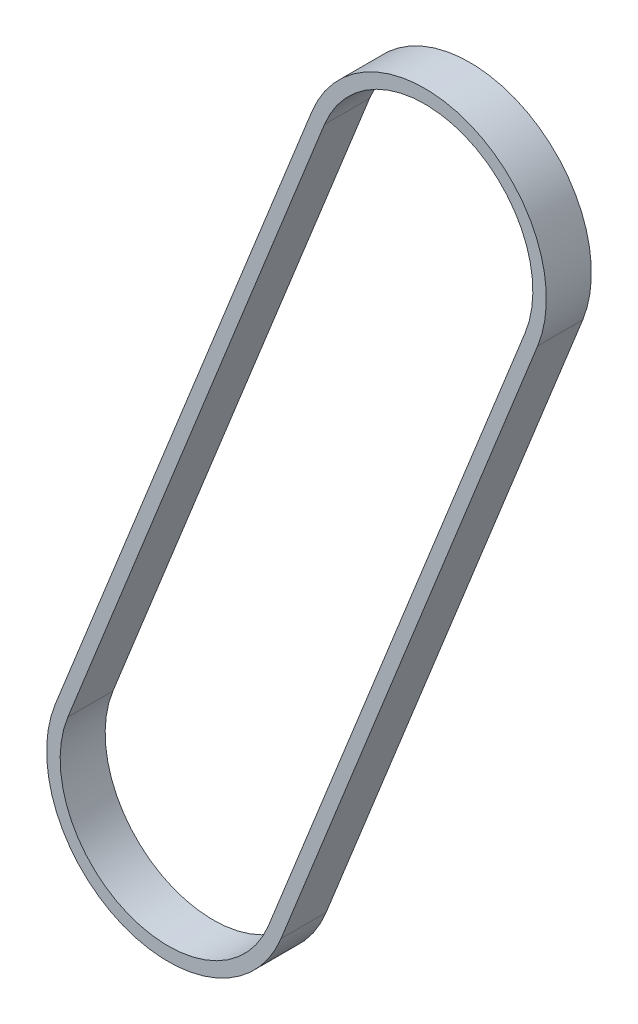
ISO-10303-21;
HEADER;
FILE_DESCRIPTION(('STEP AP214'),'2;1');
FILE_NAME('part.step','',(''),(''),'','','');
FILE_SCHEMA(('AUTOMOTIVE_DESIGN { 1 0 10303 214 1 1 1 1 }'));
ENDSEC;
DATA;
#1=APPLICATION_CONTEXT('core data for automotive mechanical design processes');
#2=APPLICATION_PROTOCOL_DEFINITION('international standard','automotive_design',2000,#1);
#3=PRODUCT_CONTEXT('',#1,'mechanical');
#4=PRODUCT('Part','Part','',(#3));
#5=PRODUCT_RELATED_PRODUCT_CATEGORY('part','',(#4));
#6=PRODUCT_DEFINITION_FORMATION('','',#4);
#7=PRODUCT_DEFINITION_CONTEXT('part definition',#1,'design');
#8=PRODUCT_DEFINITION('design','',#6,#7);
#9=PRODUCT_DEFINITION_SHAPE('','',#8);
#10=(LENGTH_UNIT() NAMED_UNIT(*) SI_UNIT(.MILLI.,.METRE.));
#11=(NAMED_UNIT(*) PLANE_ANGLE_UNIT() SI_UNIT($,.RADIAN.));
#12=(NAMED_UNIT(*) SI_UNIT($,.STERADIAN.) SOLID_ANGLE_UNIT());
#13=UNCERTAINTY_MEASURE_WITH_UNIT(LENGTH_MEASURE(1.E-05),#10,'distance_accuracy_value','');
#14=(GEOMETRIC_REPRESENTATION_CONTEXT(3) GLOBAL_UNCERTAINTY_ASSIGNED_CONTEXT((#13)) GLOBAL_UNIT_ASSIGNED_CONTEXT((#10,
#11,#12)) REPRESENTATION_CONTEXT('',''));
#15=CARTESIAN_POINT('',(0.,0.,0.));
#16=DIRECTION('',(0.,0.,1.));
#17=DIRECTION('',(1.,0.,0.));
#18=AXIS2_PLACEMENT_3D('',#15,#16,#17);
#19=CARTESIAN_POINT('',(-22.2834405812392,8.91337623249579,-10.));
#20=DIRECTION('',(0.,0.,1.));
#21=DIRECTION('',(-0.371390676354108,-0.928476690885258,0.));
#22=AXIS2_PLACEMENT_3D('',#19,#20,#21);
#23=PLANE('',#22);
#24=DIRECTION('',(-0.371390676354108,-0.928476690885258,0.));
#25=VECTOR('',#24,1.);
#26=CARTESIAN_POINT('',(-22.2834405812392,8.91337623249579,-10.));
#27=LINE('',#26,#25);
#28=CARTESIAN_POINT('',(34.716559418757,151.413376232484,-10.));
#29=VERTEX_POINT('',#28);
#30=CARTESIAN_POINT('',(-22.2834405812392,8.91337623249579,-10.));
#31=VERTEX_POINT('',#30);
#32=EDGE_CURVE('E119',#29,#31,#27,.T.);
#33=ORIENTED_EDGE('',*,*,#32,.T.);
#34=CARTESIAN_POINT('',(0.,0.,-10.));
#35=DIRECTION('',(0.,0.,1.));
#36=DIRECTION('',(-1.,0.,0.));
#37=AXIS2_PLACEMENT_3D('',#34,#35,#36);
#38=CIRCLE('',#37,23.9999999999925);
#39=CARTESIAN_POINT('',(22.2834405812391,-8.91337623249586,-10.));
#40=VERTEX_POINT('',#39);
#41=EDGE_CURVE('E46',#31,#40,#38,.T.);
#42=ORIENTED_EDGE('',*,*,#41,.T.);
#43=DIRECTION('',(0.371390676354111,0.928476690885257,0.));
#44=VECTOR('',#43,1.);
#45=CARTESIAN_POINT('',(79.2834405812358,133.586623767493,-10.));
#46=LINE('',#45,#44);
#47=CARTESIAN_POINT('',(79.2834405812358,133.586623767493,-10.));
#48=VERTEX_POINT('',#47);
#49=EDGE_CURVE('E182',#40,#48,#46,.T.);
#50=ORIENTED_EDGE('',*,*,#49,.T.);
#51=CARTESIAN_POINT('',(56.9999999999964,142.499999999989,-10.));
#52=DIRECTION('',(0.,0.,1.));
#53=DIRECTION('',(-1.,0.,0.));
#54=AXIS2_PLACEMENT_3D('',#51,#52,#53);
#55=CIRCLE('',#54,23.9999999999927);
#56=EDGE_CURVE('E165',#48,#29,#55,.T.);
#57=ORIENTED_EDGE('',*,*,#56,.T.);
#58=EDGE_LOOP('',(#33,#42,#50,#57));
#59=FACE_BOUND('',#58,.T.);
#60=DIRECTION('',(0.371390676354108,0.928476690885258,0.));
#61=VECTOR('',#60,1.);
#62=CARTESIAN_POINT('',(-25.068870653895,10.0275482615581,-10.));
#63=LINE('',#62,#61);
#64=CARTESIAN_POINT('',(31.9311293461013,152.527548261547,-10.));
#65=VERTEX_POINT('',#64);
#66=CARTESIAN_POINT('',(-25.068870653895,10.0275482615581,-10.));
#67=VERTEX_POINT('',#66);
#68=EDGE_CURVE('E126',#65,#67,#63,.F.);
#69=ORIENTED_EDGE('',*,*,#68,.F.);
#70=CARTESIAN_POINT('',(56.9999999999964,142.499999999989,-10.));
#71=DIRECTION('',(0.,0.,-1.));
#72=DIRECTION('',(-1.,0.,0.));
#73=AXIS2_PLACEMENT_3D('',#70,#71,#72);
#74=CIRCLE('',#73,26.9999999999927);
#75=CARTESIAN_POINT('',(82.0688706538916,132.47245173843,-10.));
#76=VERTEX_POINT('',#75);
#77=EDGE_CURVE('E132',#76,#65,#74,.F.);
#78=ORIENTED_EDGE('',*,*,#77,.F.);
#79=DIRECTION('',(-0.371390676354111,-0.928476690885256,0.));
#80=VECTOR('',#79,1.);
#81=CARTESIAN_POINT('',(82.0688706538916,132.47245173843,-10.));
#82=LINE('',#81,#80);
#83=CARTESIAN_POINT('',(25.0688706538949,-10.0275482615582,-10.));
#84=VERTEX_POINT('',#83);
#85=EDGE_CURVE('E110',#84,#76,#82,.F.);
#86=ORIENTED_EDGE('',*,*,#85,.F.);
#87=CARTESIAN_POINT('',(0.,0.,-10.));
#88=DIRECTION('',(0.,0.,-1.));
#89=DIRECTION('',(-1.,0.,0.));
#90=AXIS2_PLACEMENT_3D('',#87,#88,#89);
#91=CIRCLE('',#90,26.9999999999925);
#92=EDGE_CURVE('E108',#67,#84,#91,.F.);
#93=ORIENTED_EDGE('',*,*,#92,.F.);
#94=EDGE_LOOP('',(#69,#78,#86,#93));
#95=FACE_BOUND('',#94,.T.);
#96=ADVANCED_FACE('F36',(#59,#95),#23,.F.);
#97=CARTESIAN_POINT('',(79.2834405812358,133.586623767493,0.));
#98=DIRECTION('',(0.,0.,1.));
#99=DIRECTION('',(0.371390676354111,0.928476690885257,0.));
#100=AXIS2_PLACEMENT_3D('',#97,#98,#99);
#101=PLANE('',#100);
#102=DIRECTION('',(0.371390676354111,0.928476690885257,0.));
#103=VECTOR('',#102,1.);
#104=CARTESIAN_POINT('',(79.2834405812358,133.586623767493,0.));
#105=LINE('',#104,#103);
#106=CARTESIAN_POINT('',(22.2834405812391,-8.91337623249586,0.));
#107=VERTEX_POINT('',#106);
#108=CARTESIAN_POINT('',(79.2834405812358,133.586623767493,0.));
#109=VERTEX_POINT('',#108);
#110=EDGE_CURVE('E172',#107,#109,#105,.T.);
#111=ORIENTED_EDGE('',*,*,#110,.F.);
#112=CARTESIAN_POINT('',(0.,0.,0.));
#113=DIRECTION('',(0.,0.,1.));
#114=DIRECTION('',(-1.,0.,0.));
#115=AXIS2_PLACEMENT_3D('',#112,#113,#114);
#116=CIRCLE('',#115,23.9999999999925);
#117=CARTESIAN_POINT('',(-22.2834405812392,8.91337623249579,0.));
#118=VERTEX_POINT('',#117);
#119=EDGE_CURVE('E11',#118,#107,#116,.T.);
#120=ORIENTED_EDGE('',*,*,#119,.F.);
#121=DIRECTION('',(-0.371390676354108,-0.928476690885258,0.));
#122=VECTOR('',#121,1.);
#123=CARTESIAN_POINT('',(-22.2834405812392,8.91337623249579,0.));
#124=LINE('',#123,#122);
#125=CARTESIAN_POINT('',(34.716559418757,151.413376232484,0.));
#126=VERTEX_POINT('',#125);
#127=EDGE_CURVE('E55',#126,#118,#124,.T.);
#128=ORIENTED_EDGE('',*,*,#127,.F.);
#129=CARTESIAN_POINT('',(56.9999999999964,142.499999999989,0.));
#130=DIRECTION('',(0.,0.,1.));
#131=DIRECTION('',(-1.,0.,0.));
#132=AXIS2_PLACEMENT_3D('',#129,#130,#131);
#133=CIRCLE('',#132,23.9999999999927);
#134=EDGE_CURVE('E184',#109,#126,#133,.T.);
#135=ORIENTED_EDGE('',*,*,#134,.F.);
#136=EDGE_LOOP('',(#111,#120,#128,#135));
#137=FACE_BOUND('',#136,.T.);
#138=DIRECTION('',(-0.371390676354111,-0.928476690885256,0.));
#139=VECTOR('',#138,1.);
#140=CARTESIAN_POINT('',(82.0688706538916,132.47245173843,0.));
#141=LINE('',#140,#139);
#142=CARTESIAN_POINT('',(25.0688706538949,-10.0275482615582,0.));
#143=VERTEX_POINT('',#142);
#144=CARTESIAN_POINT('',(82.0688706538916,132.47245173843,0.));
#145=VERTEX_POINT('',#144);
#146=EDGE_CURVE('E40',#143,#145,#141,.F.);
#147=ORIENTED_EDGE('',*,*,#146,.T.);
#148=CARTESIAN_POINT('',(56.9999999999964,142.499999999989,0.));
#149=DIRECTION('',(0.,0.,-1.));
#150=DIRECTION('',(-1.,0.,0.));
#151=AXIS2_PLACEMENT_3D('',#148,#149,#150);
#152=CIRCLE('',#151,26.9999999999927);
#153=CARTESIAN_POINT('',(31.9311293461013,152.527548261547,0.));
#154=VERTEX_POINT('',#153);
#155=EDGE_CURVE('E130',#145,#154,#152,.F.);
#156=ORIENTED_EDGE('',*,*,#155,.T.);
#157=DIRECTION('',(0.371390676354108,0.928476690885258,0.));
#158=VECTOR('',#157,1.);
#159=CARTESIAN_POINT('',(-25.068870653895,10.0275482615581,0.));
#160=LINE('',#159,#158);
#161=CARTESIAN_POINT('',(-25.0688706538949,10.0275482615581,0.));
#162=VERTEX_POINT('',#161);
#163=EDGE_CURVE('E118',#154,#162,#160,.F.);
#164=ORIENTED_EDGE('',*,*,#163,.T.);
#165=CARTESIAN_POINT('',(0.,0.,0.));
#166=DIRECTION('',(0.,0.,-1.));
#167=DIRECTION('',(-1.,0.,0.));
#168=AXIS2_PLACEMENT_3D('',#165,#166,#167);
#169=CIRCLE('',#168,26.9999999999925);
#170=EDGE_CURVE('E106',#162,#143,#169,.F.);
#171=ORIENTED_EDGE('',*,*,#170,.T.);
#172=EDGE_LOOP('',(#147,#156,#164,#171));
#173=FACE_BOUND('',#172,.T.);
#174=ADVANCED_FACE('F38',(#137,#173),#101,.T.);
#175=CARTESIAN_POINT('',(0.,0.,0.));
#176=DIRECTION('',(0.,0.,-1.));
#177=DIRECTION('',(-1.,0.,0.));
#178=AXIS2_PLACEMENT_3D('',#175,#176,#177);
#179=CYLINDRICAL_SURFACE('',#178,23.9999999999925);
#180=ORIENTED_EDGE('',*,*,#41,.F.);
#181=DIRECTION('',(0.,0.,-1.));
#182=VECTOR('',#181,1.);
#183=CARTESIAN_POINT('',(-22.2834405812392,8.91337623249579,0.));
#184=LINE('',#183,#182);
#185=EDGE_CURVE('E169',#118,#31,#184,.T.);
#186=ORIENTED_EDGE('',*,*,#185,.F.);
#187=ORIENTED_EDGE('',*,*,#119,.T.);
#188=DIRECTION('',(0.,0.,-1.));
#189=VECTOR('',#188,1.);
#190=CARTESIAN_POINT('',(22.2834405812391,-8.91337623249586,0.));
#191=LINE('',#190,#189);
#192=EDGE_CURVE('E171',#107,#40,#191,.T.);
#193=ORIENTED_EDGE('',*,*,#192,.T.);
#194=EDGE_LOOP('',(#180,#186,#187,#193));
#195=FACE_BOUND('',#194,.T.);
#196=ADVANCED_FACE('F158',(#195),#179,.F.);
#197=CARTESIAN_POINT('',(79.2834405812358,133.586623767493,0.));
#198=DIRECTION('',(-0.928476690885257,0.371390676354111,0.));
#199=DIRECTION('',(-0.371390676354111,-0.928476690885256,0.));
#200=AXIS2_PLACEMENT_3D('',#197,#198,#199);
#201=PLANE('',#200);
#202=ORIENTED_EDGE('',*,*,#49,.F.);
#203=ORIENTED_EDGE('',*,*,#192,.F.);
#204=ORIENTED_EDGE('',*,*,#110,.T.);
#205=DIRECTION('',(0.,0.,-1.));
#206=VECTOR('',#205,1.);
#207=CARTESIAN_POINT('',(79.2834405812358,133.586623767493,0.));
#208=LINE('',#207,#206);
#209=EDGE_CURVE('E176',#109,#48,#208,.T.);
#210=ORIENTED_EDGE('',*,*,#209,.T.);
#211=EDGE_LOOP('',(#202,#203,#204,#210));
#212=FACE_BOUND('',#211,.T.);
#213=ADVANCED_FACE('F194',(#212),#201,.T.);
#214=CARTESIAN_POINT('',(56.9999999999964,142.499999999989,0.));
#215=DIRECTION('',(0.,0.,-1.));
#216=DIRECTION('',(-1.,0.,0.));
#217=AXIS2_PLACEMENT_3D('',#214,#215,#216);
#218=CYLINDRICAL_SURFACE('',#217,23.9999999999927);
#219=ORIENTED_EDGE('',*,*,#56,.F.);
#220=ORIENTED_EDGE('',*,*,#209,.F.);
#221=ORIENTED_EDGE('',*,*,#134,.T.);
#222=DIRECTION('',(0.,0.,-1.));
#223=VECTOR('',#222,1.);
#224=CARTESIAN_POINT('',(34.716559418757,151.413376232484,0.));
#225=LINE('',#224,#223);
#226=EDGE_CURVE('E121',#126,#29,#225,.T.);
#227=ORIENTED_EDGE('',*,*,#226,.T.);
#228=EDGE_LOOP('',(#219,#220,#221,#227));
#229=FACE_BOUND('',#228,.T.);
#230=ADVANCED_FACE('F196',(#229),#218,.F.);
#231=CARTESIAN_POINT('',(-22.2834405812392,8.91337623249579,0.));
#232=DIRECTION('',(0.928476690885258,-0.371390676354108,0.));
#233=DIRECTION('',(0.371390676354108,0.928476690885258,0.));
#234=AXIS2_PLACEMENT_3D('',#231,#232,#233);
#235=PLANE('',#234);
#236=ORIENTED_EDGE('',*,*,#32,.F.);
#237=ORIENTED_EDGE('',*,*,#226,.F.);
#238=ORIENTED_EDGE('',*,*,#127,.T.);
#239=ORIENTED_EDGE('',*,*,#185,.T.);
#240=EDGE_LOOP('',(#236,#237,#238,#239));
#241=FACE_BOUND('',#240,.T.);
#242=ADVANCED_FACE('F174',(#241),#235,.T.);
#243=CARTESIAN_POINT('',(0.,0.,0.));
#244=DIRECTION('',(0.,0.,-1.));
#245=DIRECTION('',(-1.,0.,0.));
#246=AXIS2_PLACEMENT_3D('',#243,#244,#245);
#247=CYLINDRICAL_SURFACE('',#246,26.9999999999925);
#248=ORIENTED_EDGE('',*,*,#92,.T.);
#249=DIRECTION('',(0.,0.,-1.));
#250=VECTOR('',#249,1.);
#251=CARTESIAN_POINT('',(25.0688706538949,-10.0275482615582,0.));
#252=LINE('',#251,#250);
#253=EDGE_CURVE('E103',#143,#84,#252,.T.);
#254=ORIENTED_EDGE('',*,*,#253,.F.);
#255=ORIENTED_EDGE('',*,*,#170,.F.);
#256=DIRECTION('',(0.,0.,1.));
#257=VECTOR('',#256,1.);
#258=CARTESIAN_POINT('',(-25.068870653895,10.0275482615581,0.));
#259=LINE('',#258,#257);
#260=EDGE_CURVE('E128',#162,#67,#259,.F.);
#261=ORIENTED_EDGE('',*,*,#260,.T.);
#262=EDGE_LOOP('',(#248,#254,#255,#261));
#263=FACE_BOUND('',#262,.T.);
#264=ADVANCED_FACE('F104',(#263),#247,.T.);
#265=CARTESIAN_POINT('',(82.0688706538916,132.47245173843,0.));
#266=DIRECTION('',(-0.928476690885257,0.371390676354111,0.));
#267=DIRECTION('',(-0.371390676354111,-0.928476690885256,0.));
#268=AXIS2_PLACEMENT_3D('',#265,#266,#267);
#269=PLANE('',#268);
#270=ORIENTED_EDGE('',*,*,#85,.T.);
#271=DIRECTION('',(0.,0.,1.));
#272=VECTOR('',#271,1.);
#273=CARTESIAN_POINT('',(82.0688706538916,132.47245173843,0.));
#274=LINE('',#273,#272);
#275=EDGE_CURVE('E97',#145,#76,#274,.F.);
#276=ORIENTED_EDGE('',*,*,#275,.F.);
#277=ORIENTED_EDGE('',*,*,#146,.F.);
#278=ORIENTED_EDGE('',*,*,#253,.T.);
#279=EDGE_LOOP('',(#270,#276,#277,#278));
#280=FACE_BOUND('',#279,.T.);
#281=ADVANCED_FACE('F113',(#280),#269,.F.);
#282=CARTESIAN_POINT('',(56.9999999999964,142.499999999989,0.));
#283=DIRECTION('',(0.,0.,-1.));
#284=DIRECTION('',(-1.,0.,0.));
#285=AXIS2_PLACEMENT_3D('',#282,#283,#284);
#286=CYLINDRICAL_SURFACE('',#285,26.9999999999927);
#287=ORIENTED_EDGE('',*,*,#77,.T.);
#288=DIRECTION('',(0.,0.,-1.));
#289=VECTOR('',#288,1.);
#290=CARTESIAN_POINT('',(31.9311293461013,152.527548261547,0.));
#291=LINE('',#290,#289);
#292=EDGE_CURVE('E129',#154,#65,#291,.T.);
#293=ORIENTED_EDGE('',*,*,#292,.F.);
#294=ORIENTED_EDGE('',*,*,#155,.F.);
#295=ORIENTED_EDGE('',*,*,#275,.T.);
#296=EDGE_LOOP('',(#287,#293,#294,#295));
#297=FACE_BOUND('',#296,.T.);
#298=ADVANCED_FACE('F144',(#297),#286,.T.);
#299=CARTESIAN_POINT('',(-25.068870653895,10.0275482615581,0.));
#300=DIRECTION('',(0.928476690885258,-0.371390676354108,0.));
#301=DIRECTION('',(0.371390676354108,0.928476690885258,0.));
#302=AXIS2_PLACEMENT_3D('',#299,#300,#301);
#303=PLANE('',#302);
#304=ORIENTED_EDGE('',*,*,#68,.T.);
#305=ORIENTED_EDGE('',*,*,#260,.F.);
#306=ORIENTED_EDGE('',*,*,#163,.F.);
#307=ORIENTED_EDGE('',*,*,#292,.T.);
#308=EDGE_LOOP('',(#304,#305,#306,#307));
#309=FACE_BOUND('',#308,.T.);
#310=ADVANCED_FACE('F141',(#309),#303,.F.);
#311=CLOSED_SHELL('',(#96,#174,#196,#213,#230,#242,#264,#281,#298,#310));
#312=MANIFOLD_SOLID_BREP('B2',#311);
#313=ADVANCED_BREP_SHAPE_REPRESENTATION('',(#18,#312),#14);
#314=SHAPE_DEFINITION_REPRESENTATION(#9,#313);
ENDSEC;
END-ISO-10303-21;
